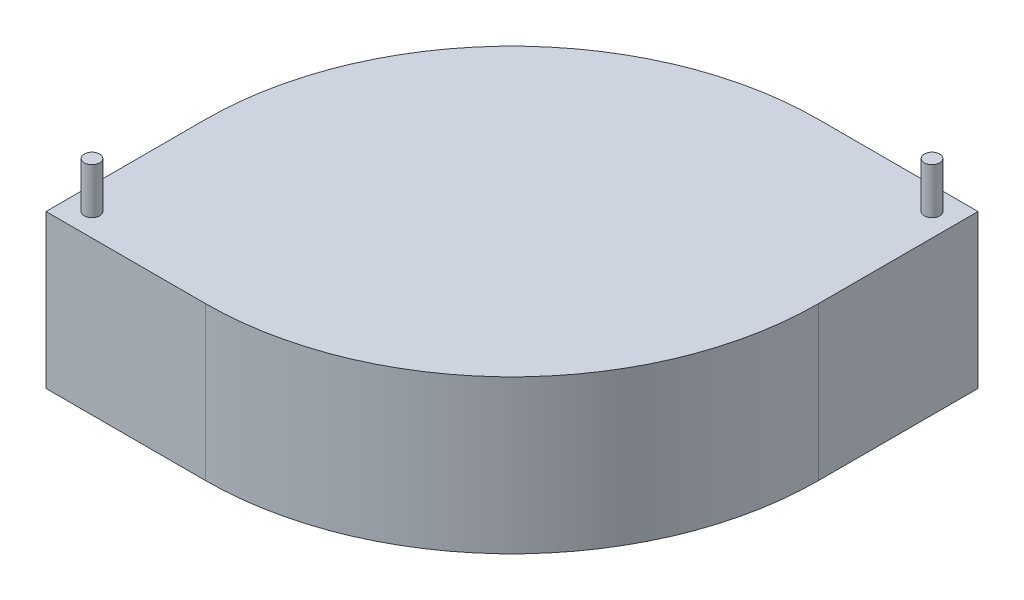
ISO-10303-21;
HEADER;
FILE_DESCRIPTION(('STEP AP214'),'2;1');
FILE_NAME('part.step','',(''),(''),'','','');
FILE_SCHEMA(('AUTOMOTIVE_DESIGN { 1 0 10303 214 1 1 1 1 }'));
ENDSEC;
DATA;
#1=APPLICATION_CONTEXT('core data for automotive mechanical design processes');
#2=APPLICATION_PROTOCOL_DEFINITION('international standard','automotive_design',2000,#1);
#3=PRODUCT_CONTEXT('',#1,'mechanical');
#4=PRODUCT('Part','Part','',(#3));
#5=PRODUCT_RELATED_PRODUCT_CATEGORY('part','',(#4));
#6=PRODUCT_DEFINITION_FORMATION('','',#4);
#7=PRODUCT_DEFINITION_CONTEXT('part definition',#1,'design');
#8=PRODUCT_DEFINITION('design','',#6,#7);
#9=PRODUCT_DEFINITION_SHAPE('','',#8);
#10=(LENGTH_UNIT() NAMED_UNIT(*) SI_UNIT(.MILLI.,.METRE.));
#11=(NAMED_UNIT(*) PLANE_ANGLE_UNIT() SI_UNIT($,.RADIAN.));
#12=(NAMED_UNIT(*) SI_UNIT($,.STERADIAN.) SOLID_ANGLE_UNIT());
#13=UNCERTAINTY_MEASURE_WITH_UNIT(LENGTH_MEASURE(1.E-05),#10,'distance_accuracy_value','');
#14=(GEOMETRIC_REPRESENTATION_CONTEXT(3) GLOBAL_UNCERTAINTY_ASSIGNED_CONTEXT((#13)) GLOBAL_UNIT_ASSIGNED_CONTEXT((#10,
#11,#12)) REPRESENTATION_CONTEXT('',''));
#15=CARTESIAN_POINT('',(0.,0.,0.));
#16=DIRECTION('',(0.,0.,1.));
#17=DIRECTION('',(1.,0.,0.));
#18=AXIS2_PLACEMENT_3D('',#15,#16,#17);
#19=CARTESIAN_POINT('',(0.,100.,0.));
#20=DIRECTION('',(1.,0.,0.));
#21=DIRECTION('',(0.,0.,-1.));
#22=AXIS2_PLACEMENT_3D('',#19,#20,#21);
#23=PLANE('',#22);
#24=DIRECTION('',(0.,0.,1.));
#25=VECTOR('',#24,1.);
#26=CARTESIAN_POINT('',(0.,0.,0.));
#27=LINE('',#26,#25);
#28=CARTESIAN_POINT('',(0.,0.,-104.));
#29=VERTEX_POINT('',#28);
#30=CARTESIAN_POINT('',(0.,0.,0.));
#31=VERTEX_POINT('',#30);
#32=EDGE_CURVE('E122',#29,#31,#27,.T.);
#33=ORIENTED_EDGE('',*,*,#32,.T.);
#34=DIRECTION('',(0.,-1.,0.));
#35=VECTOR('',#34,1.);
#36=CARTESIAN_POINT('',(0.,100.,0.));
#37=LINE('',#36,#35);
#38=CARTESIAN_POINT('',(0.,100.,0.));
#39=VERTEX_POINT('',#38);
#40=EDGE_CURVE('E140',#39,#31,#37,.T.);
#41=ORIENTED_EDGE('',*,*,#40,.F.);
#42=DIRECTION('',(0.,0.,1.));
#43=VECTOR('',#42,1.);
#44=CARTESIAN_POINT('',(0.,100.,0.));
#45=LINE('',#44,#43);
#46=CARTESIAN_POINT('',(0.,100.,-104.));
#47=VERTEX_POINT('',#46);
#48=EDGE_CURVE('E133',#47,#39,#45,.T.);
#49=ORIENTED_EDGE('',*,*,#48,.F.);
#50=DIRECTION('',(0.,-1.,0.));
#51=VECTOR('',#50,1.);
#52=CARTESIAN_POINT('',(0.,100.,-104.));
#53=LINE('',#52,#51);
#54=EDGE_CURVE('E118',#47,#29,#53,.T.);
#55=ORIENTED_EDGE('',*,*,#54,.T.);
#56=EDGE_LOOP('',(#33,#41,#49,#55));
#57=FACE_BOUND('',#56,.T.);
#58=ADVANCED_FACE('F37',(#57),#23,.F.);
#59=CARTESIAN_POINT('',(0.,100.,0.));
#60=DIRECTION('',(0.,0.,-1.));
#61=DIRECTION('',(-1.,0.,0.));
#62=AXIS2_PLACEMENT_3D('',#59,#60,#61);
#63=PLANE('',#62);
#64=DIRECTION('',(1.,0.,0.));
#65=VECTOR('',#64,1.);
#66=CARTESIAN_POINT('',(0.,0.,0.));
#67=LINE('',#66,#65);
#68=CARTESIAN_POINT('',(104.,0.,0.));
#69=VERTEX_POINT('',#68);
#70=EDGE_CURVE('E125',#31,#69,#67,.T.);
#71=ORIENTED_EDGE('',*,*,#70,.T.);
#72=DIRECTION('',(0.,-1.,0.));
#73=VECTOR('',#72,1.);
#74=CARTESIAN_POINT('',(104.,100.,0.));
#75=LINE('',#74,#73);
#76=CARTESIAN_POINT('',(104.,100.,0.));
#77=VERTEX_POINT('',#76);
#78=EDGE_CURVE('E137',#77,#69,#75,.T.);
#79=ORIENTED_EDGE('',*,*,#78,.F.);
#80=DIRECTION('',(1.,0.,0.));
#81=VECTOR('',#80,1.);
#82=CARTESIAN_POINT('',(0.,100.,0.));
#83=LINE('',#82,#81);
#84=EDGE_CURVE('E91',#39,#77,#83,.T.);
#85=ORIENTED_EDGE('',*,*,#84,.F.);
#86=ORIENTED_EDGE('',*,*,#40,.T.);
#87=EDGE_LOOP('',(#71,#79,#85,#86));
#88=FACE_BOUND('',#87,.T.);
#89=ADVANCED_FACE('F161',(#88),#63,.F.);
#90=CARTESIAN_POINT('',(104.,100.,-200.));
#91=DIRECTION('',(0.,-1.,0.));
#92=DIRECTION('',(0.,0.,-1.));
#93=AXIS2_PLACEMENT_3D('',#90,#91,#92);
#94=CYLINDRICAL_SURFACE('',#93,200.);
#95=CARTESIAN_POINT('',(104.,0.,-200.));
#96=DIRECTION('',(0.,1.,0.));
#97=DIRECTION('',(0.,0.,1.));
#98=AXIS2_PLACEMENT_3D('',#95,#96,#97);
#99=CIRCLE('',#98,200.);
#100=CARTESIAN_POINT('',(304.,0.,-200.));
#101=VERTEX_POINT('',#100);
#102=EDGE_CURVE('E128',#69,#101,#99,.T.);
#103=ORIENTED_EDGE('',*,*,#102,.T.);
#104=DIRECTION('',(0.,-1.,0.));
#105=VECTOR('',#104,1.);
#106=CARTESIAN_POINT('',(304.,100.,-200.));
#107=LINE('',#106,#105);
#108=CARTESIAN_POINT('',(304.,100.,-200.));
#109=VERTEX_POINT('',#108);
#110=EDGE_CURVE('E113',#109,#101,#107,.T.);
#111=ORIENTED_EDGE('',*,*,#110,.F.);
#112=CARTESIAN_POINT('',(104.,100.,-200.));
#113=DIRECTION('',(0.,1.,0.));
#114=DIRECTION('',(0.,0.,1.));
#115=AXIS2_PLACEMENT_3D('',#112,#113,#114);
#116=CIRCLE('',#115,200.);
#117=EDGE_CURVE('E104',#77,#109,#116,.T.);
#118=ORIENTED_EDGE('',*,*,#117,.F.);
#119=ORIENTED_EDGE('',*,*,#78,.T.);
#120=EDGE_LOOP('',(#103,#111,#118,#119));
#121=FACE_BOUND('',#120,.T.);
#122=ADVANCED_FACE('F166',(#121),#94,.T.);
#123=CARTESIAN_POINT('',(304.,100.,-200.));
#124=DIRECTION('',(-1.,0.,0.));
#125=DIRECTION('',(0.,0.,1.));
#126=AXIS2_PLACEMENT_3D('',#123,#124,#125);
#127=PLANE('',#126);
#128=DIRECTION('',(0.,0.,-1.));
#129=VECTOR('',#128,1.);
#130=CARTESIAN_POINT('',(304.,0.,-200.));
#131=LINE('',#130,#129);
#132=CARTESIAN_POINT('',(304.,0.,-304.));
#133=VERTEX_POINT('',#132);
#134=EDGE_CURVE('E112',#101,#133,#131,.T.);
#135=ORIENTED_EDGE('',*,*,#134,.T.);
#136=DIRECTION('',(0.,-1.,0.));
#137=VECTOR('',#136,1.);
#138=CARTESIAN_POINT('',(304.,100.,-304.));
#139=LINE('',#138,#137);
#140=CARTESIAN_POINT('',(304.,100.,-304.));
#141=VERTEX_POINT('',#140);
#142=EDGE_CURVE('E109',#141,#133,#139,.T.);
#143=ORIENTED_EDGE('',*,*,#142,.F.);
#144=DIRECTION('',(0.,0.,-1.));
#145=VECTOR('',#144,1.);
#146=CARTESIAN_POINT('',(304.,100.,-200.));
#147=LINE('',#146,#145);
#148=EDGE_CURVE('E98',#109,#141,#147,.T.);
#149=ORIENTED_EDGE('',*,*,#148,.F.);
#150=ORIENTED_EDGE('',*,*,#110,.T.);
#151=EDGE_LOOP('',(#135,#143,#149,#150));
#152=FACE_BOUND('',#151,.T.);
#153=ADVANCED_FACE('F110',(#152),#127,.F.);
#154=CARTESIAN_POINT('',(200.,100.,-304.));
#155=DIRECTION('',(0.,0.,1.));
#156=DIRECTION('',(1.,0.,0.));
#157=AXIS2_PLACEMENT_3D('',#154,#155,#156);
#158=PLANE('',#157);
#159=DIRECTION('',(-1.,0.,0.));
#160=VECTOR('',#159,1.);
#161=CARTESIAN_POINT('',(200.,0.,-304.));
#162=LINE('',#161,#160);
#163=CARTESIAN_POINT('',(200.,0.,-304.));
#164=VERTEX_POINT('',#163);
#165=EDGE_CURVE('E76',#133,#164,#162,.T.);
#166=ORIENTED_EDGE('',*,*,#165,.T.);
#167=DIRECTION('',(0.,-1.,0.));
#168=VECTOR('',#167,1.);
#169=CARTESIAN_POINT('',(200.,100.,-304.));
#170=LINE('',#169,#168);
#171=CARTESIAN_POINT('',(200.,100.,-304.));
#172=VERTEX_POINT('',#171);
#173=EDGE_CURVE('E114',#172,#164,#170,.T.);
#174=ORIENTED_EDGE('',*,*,#173,.F.);
#175=DIRECTION('',(-1.,0.,0.));
#176=VECTOR('',#175,1.);
#177=CARTESIAN_POINT('',(200.,100.,-304.));
#178=LINE('',#177,#176);
#179=EDGE_CURVE('E102',#141,#172,#178,.T.);
#180=ORIENTED_EDGE('',*,*,#179,.F.);
#181=ORIENTED_EDGE('',*,*,#142,.T.);
#182=EDGE_LOOP('',(#166,#174,#180,#181));
#183=FACE_BOUND('',#182,.T.);
#184=ADVANCED_FACE('F116',(#183),#158,.F.);
#185=CARTESIAN_POINT('',(200.,100.,-104.));
#186=DIRECTION('',(0.,-1.,0.));
#187=DIRECTION('',(0.,0.,-1.));
#188=AXIS2_PLACEMENT_3D('',#185,#186,#187);
#189=CYLINDRICAL_SURFACE('',#188,200.);
#190=CARTESIAN_POINT('',(200.,0.,-104.));
#191=DIRECTION('',(0.,1.,0.));
#192=DIRECTION('',(0.,0.,-1.));
#193=AXIS2_PLACEMENT_3D('',#190,#191,#192);
#194=CIRCLE('',#193,200.);
#195=EDGE_CURVE('E82',#164,#29,#194,.T.);
#196=ORIENTED_EDGE('',*,*,#195,.T.);
#197=ORIENTED_EDGE('',*,*,#54,.F.);
#198=CARTESIAN_POINT('',(200.,100.,-104.));
#199=DIRECTION('',(0.,1.,0.));
#200=DIRECTION('',(0.,0.,-1.));
#201=AXIS2_PLACEMENT_3D('',#198,#199,#200);
#202=CIRCLE('',#201,200.);
#203=EDGE_CURVE('E53',#172,#47,#202,.T.);
#204=ORIENTED_EDGE('',*,*,#203,.F.);
#205=ORIENTED_EDGE('',*,*,#173,.T.);
#206=EDGE_LOOP('',(#196,#197,#204,#205));
#207=FACE_BOUND('',#206,.T.);
#208=ADVANCED_FACE('F148',(#207),#189,.T.);
#209=CARTESIAN_POINT('',(200.,100.,-104.));
#210=DIRECTION('',(0.,-1.,0.));
#211=DIRECTION('',(0.,0.,-1.));
#212=AXIS2_PLACEMENT_3D('',#209,#210,#211);
#213=PLANE('',#212);
#214=CARTESIAN_POINT('',(289.,100.,-289.));
#215=DIRECTION('',(0.,-1.,0.));
#216=DIRECTION('',(0.,0.,-1.));
#217=AXIS2_PLACEMENT_3D('',#214,#215,#216);
#218=CIRCLE('',#217,4.99999999999999);
#219=CARTESIAN_POINT('',(289.,100.,-294.));
#220=VERTEX_POINT('',#219);
#221=EDGE_CURVE('E11',#220,#220,#218,.F.);
#222=ORIENTED_EDGE('',*,*,#221,.F.);
#223=EDGE_LOOP('',(#222));
#224=FACE_BOUND('',#223,.T.);
#225=CARTESIAN_POINT('',(15.,100.,-15.));
#226=DIRECTION('',(0.,-1.,0.));
#227=DIRECTION('',(0.,0.,-1.));
#228=AXIS2_PLACEMENT_3D('',#225,#226,#227);
#229=CIRCLE('',#228,5.);
#230=CARTESIAN_POINT('',(15.,100.,-20.));
#231=VERTEX_POINT('',#230);
#232=EDGE_CURVE('E45',#231,#231,#229,.F.);
#233=ORIENTED_EDGE('',*,*,#232,.F.);
#234=EDGE_LOOP('',(#233));
#235=FACE_BOUND('',#234,.T.);
#236=ORIENTED_EDGE('',*,*,#48,.T.);
#237=ORIENTED_EDGE('',*,*,#84,.T.);
#238=ORIENTED_EDGE('',*,*,#117,.T.);
#239=ORIENTED_EDGE('',*,*,#148,.T.);
#240=ORIENTED_EDGE('',*,*,#179,.T.);
#241=ORIENTED_EDGE('',*,*,#203,.T.);
#242=EDGE_LOOP('',(#236,#237,#238,#239,#240,#241));
#243=FACE_BOUND('',#242,.T.);
#244=ADVANCED_FACE('F100',(#224,#235,#243),#213,.F.);
#245=CARTESIAN_POINT('',(200.,0.,-104.));
#246=DIRECTION('',(0.,-1.,0.));
#247=DIRECTION('',(0.,0.,-1.));
#248=AXIS2_PLACEMENT_3D('',#245,#246,#247);
#249=PLANE('',#248);
#250=ORIENTED_EDGE('',*,*,#32,.F.);
#251=ORIENTED_EDGE('',*,*,#195,.F.);
#252=ORIENTED_EDGE('',*,*,#165,.F.);
#253=ORIENTED_EDGE('',*,*,#134,.F.);
#254=ORIENTED_EDGE('',*,*,#102,.F.);
#255=ORIENTED_EDGE('',*,*,#70,.F.);
#256=EDGE_LOOP('',(#250,#251,#252,#253,#254,#255));
#257=FACE_BOUND('',#256,.T.);
#258=ADVANCED_FACE('F147',(#257),#249,.T.);
#259=CARTESIAN_POINT('',(15.,130.,-15.));
#260=DIRECTION('',(0.,-1.,0.));
#261=DIRECTION('',(0.,0.,-1.));
#262=AXIS2_PLACEMENT_3D('',#259,#260,#261);
#263=CYLINDRICAL_SURFACE('',#262,5.);
#264=CARTESIAN_POINT('',(15.,130.,-15.));
#265=DIRECTION('',(0.,1.,0.));
#266=DIRECTION('',(0.,0.,1.));
#267=AXIS2_PLACEMENT_3D('',#264,#265,#266);
#268=CIRCLE('',#267,5.);
#269=CARTESIAN_POINT('',(15.,130.,-10.));
#270=VERTEX_POINT('',#269);
#271=EDGE_CURVE('E126',#270,#270,#268,.T.);
#272=ORIENTED_EDGE('',*,*,#271,.F.);
#273=EDGE_LOOP('',(#272));
#274=FACE_BOUND('',#273,.T.);
#275=ORIENTED_EDGE('',*,*,#232,.T.);
#276=EDGE_LOOP('',(#275));
#277=FACE_BOUND('',#276,.T.);
#278=ADVANCED_FACE('F144',(#274,#277),#263,.T.);
#279=CARTESIAN_POINT('',(15.,130.,-15.));
#280=DIRECTION('',(0.,1.,0.));
#281=DIRECTION('',(0.,0.,1.));
#282=AXIS2_PLACEMENT_3D('',#279,#280,#281);
#283=PLANE('',#282);
#284=ORIENTED_EDGE('',*,*,#271,.T.);
#285=EDGE_LOOP('',(#284));
#286=FACE_BOUND('',#285,.T.);
#287=ADVANCED_FACE('F186',(#286),#283,.T.);
#288=CARTESIAN_POINT('',(289.,130.,-289.));
#289=DIRECTION('',(0.,-1.,0.));
#290=DIRECTION('',(0.,0.,-1.));
#291=AXIS2_PLACEMENT_3D('',#288,#289,#290);
#292=CYLINDRICAL_SURFACE('',#291,4.99999999999999);
#293=CARTESIAN_POINT('',(289.,130.,-289.));
#294=DIRECTION('',(0.,1.,0.));
#295=DIRECTION('',(0.,0.,1.));
#296=AXIS2_PLACEMENT_3D('',#293,#294,#295);
#297=CIRCLE('',#296,4.99999999999999);
#298=CARTESIAN_POINT('',(289.,130.,-284.));
#299=VERTEX_POINT('',#298);
#300=EDGE_CURVE('E177',#299,#299,#297,.T.);
#301=ORIENTED_EDGE('',*,*,#300,.F.);
#302=EDGE_LOOP('',(#301));
#303=FACE_BOUND('',#302,.T.);
#304=ORIENTED_EDGE('',*,*,#221,.T.);
#305=EDGE_LOOP('',(#304));
#306=FACE_BOUND('',#305,.T.);
#307=ADVANCED_FACE('F183',(#303,#306),#292,.T.);
#308=CARTESIAN_POINT('',(289.,130.,-289.));
#309=DIRECTION('',(0.,1.,0.));
#310=DIRECTION('',(0.,0.,1.));
#311=AXIS2_PLACEMENT_3D('',#308,#309,#310);
#312=PLANE('',#311);
#313=ORIENTED_EDGE('',*,*,#300,.T.);
#314=EDGE_LOOP('',(#313));
#315=FACE_BOUND('',#314,.T.);
#316=ADVANCED_FACE('F181',(#315),#312,.T.);
#317=CLOSED_SHELL('',(#58,#89,#122,#153,#184,#208,#244,#258,#278,#287,#307,#316));
#318=MANIFOLD_SOLID_BREP('B2',#317);
#319=ADVANCED_BREP_SHAPE_REPRESENTATION('',(#18,#318),#14);
#320=SHAPE_DEFINITION_REPRESENTATION(#9,#319);
ENDSEC;
END-ISO-10303-21;
